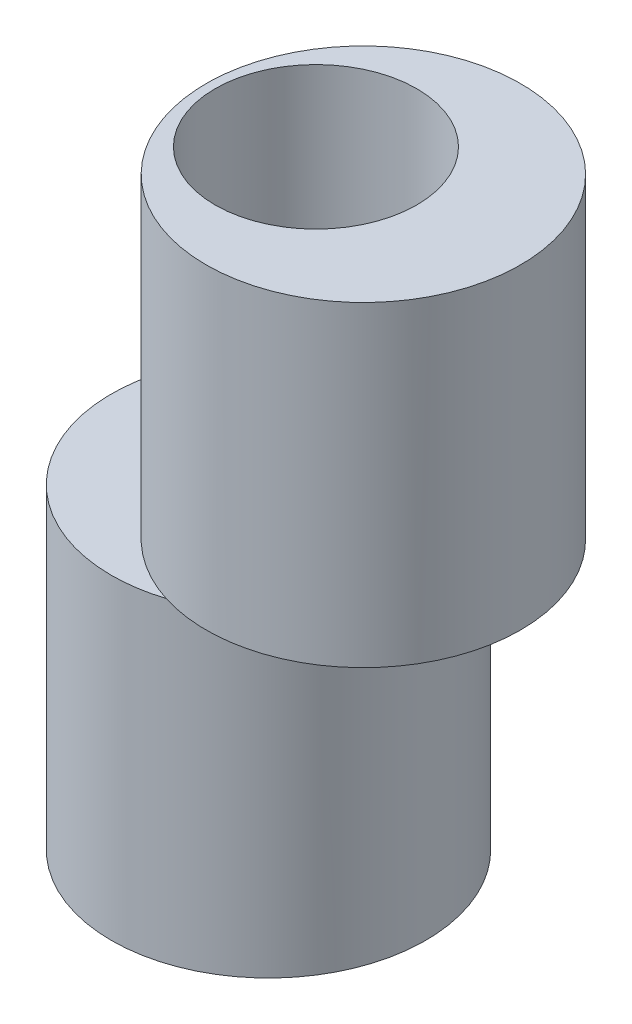
ISO-10303-21;
HEADER;
FILE_DESCRIPTION(('STEP AP214'),'2;1');
FILE_NAME('part.step','',(''),(''),'','','');
FILE_SCHEMA(('AUTOMOTIVE_DESIGN { 1 0 10303 214 1 1 1 1 }'));
ENDSEC;
DATA;
#1=APPLICATION_CONTEXT('core data for automotive mechanical design processes');
#2=APPLICATION_PROTOCOL_DEFINITION('international standard','automotive_design',2000,#1);
#3=PRODUCT_CONTEXT('',#1,'mechanical');
#4=PRODUCT('Part','Part','',(#3));
#5=PRODUCT_RELATED_PRODUCT_CATEGORY('part','',(#4));
#6=PRODUCT_DEFINITION_FORMATION('','',#4);
#7=PRODUCT_DEFINITION_CONTEXT('part definition',#1,'design');
#8=PRODUCT_DEFINITION('design','',#6,#7);
#9=PRODUCT_DEFINITION_SHAPE('','',#8);
#10=(LENGTH_UNIT() NAMED_UNIT(*) SI_UNIT(.MILLI.,.METRE.));
#11=(NAMED_UNIT(*) PLANE_ANGLE_UNIT() SI_UNIT($,.RADIAN.));
#12=(NAMED_UNIT(*) SI_UNIT($,.STERADIAN.) SOLID_ANGLE_UNIT());
#13=UNCERTAINTY_MEASURE_WITH_UNIT(LENGTH_MEASURE(1.E-05),#10,'distance_accuracy_value','');
#14=(GEOMETRIC_REPRESENTATION_CONTEXT(3) GLOBAL_UNCERTAINTY_ASSIGNED_CONTEXT((#13)) GLOBAL_UNIT_ASSIGNED_CONTEXT((#10,
#11,#12)) REPRESENTATION_CONTEXT('',''));
#15=CARTESIAN_POINT('',(0.,0.,0.));
#16=DIRECTION('',(0.,0.,1.));
#17=DIRECTION('',(1.,0.,0.));
#18=AXIS2_PLACEMENT_3D('',#15,#16,#17);
#19=CARTESIAN_POINT('',(0.,8.,0.));
#20=DIRECTION('',(0.,-1.,0.));
#21=DIRECTION('',(0.,0.,-1.));
#22=AXIS2_PLACEMENT_3D('',#19,#20,#21);
#23=CYLINDRICAL_SURFACE('',#22,3.975);
#24=CARTESIAN_POINT('',(0.,8.,0.));
#25=DIRECTION('',(0.,1.,0.));
#26=DIRECTION('',(0.,0.,1.));
#27=AXIS2_PLACEMENT_3D('',#24,#25,#26);
#28=CIRCLE('',#27,3.975);
#29=CARTESIAN_POINT('',(0.,8.,3.975));
#30=VERTEX_POINT('',#29);
#31=EDGE_CURVE('E11',#30,#30,#28,.T.);
#32=ORIENTED_EDGE('',*,*,#31,.F.);
#33=EDGE_LOOP('',(#32));
#34=FACE_BOUND('',#33,.T.);
#35=CARTESIAN_POINT('',(0.,0.,0.));
#36=DIRECTION('',(0.,1.,0.));
#37=DIRECTION('',(0.,0.,1.));
#38=AXIS2_PLACEMENT_3D('',#35,#36,#37);
#39=CIRCLE('',#38,3.975);
#40=CARTESIAN_POINT('',(-1.19999999997239,0.,-3.78954152900668));
#41=VERTEX_POINT('',#40);
#42=CARTESIAN_POINT('',(-1.19999999997238,0.,3.78954152900668));
#43=VERTEX_POINT('',#42);
#44=EDGE_CURVE('E42',#41,#43,#39,.T.);
#45=ORIENTED_EDGE('',*,*,#44,.T.);
#46=EDGE_CURVE('E66',#43,#41,#39,.T.);
#47=ORIENTED_EDGE('',*,*,#46,.T.);
#48=EDGE_LOOP('',(#45,#47));
#49=FACE_BOUND('',#48,.T.);
#50=ADVANCED_FACE('F41',(#34,#49),#23,.T.);
#51=CARTESIAN_POINT('',(0.,8.,0.));
#52=DIRECTION('',(0.,1.,0.));
#53=DIRECTION('',(0.,0.,1.));
#54=AXIS2_PLACEMENT_3D('',#51,#52,#53);
#55=PLANE('',#54);
#56=CARTESIAN_POINT('',(-1.19999999997238,8.,0.));
#57=DIRECTION('',(0.,1.,0.));
#58=DIRECTION('',(0.,0.,1.));
#59=AXIS2_PLACEMENT_3D('',#56,#57,#58);
#60=CIRCLE('',#59,2.55);
#61=CARTESIAN_POINT('',(-1.19999999997238,8.,2.55));
#62=VERTEX_POINT('',#61);
#63=EDGE_CURVE('E62',#62,#62,#60,.T.);
#64=ORIENTED_EDGE('',*,*,#63,.F.);
#65=EDGE_LOOP('',(#64));
#66=FACE_BOUND('',#65,.T.);
#67=ORIENTED_EDGE('',*,*,#31,.T.);
#68=EDGE_LOOP('',(#67));
#69=FACE_BOUND('',#68,.T.);
#70=ADVANCED_FACE('F75',(#66,#69),#55,.T.);
#71=CARTESIAN_POINT('',(0.,0.,0.));
#72=DIRECTION('',(0.,1.,0.));
#73=DIRECTION('',(0.,0.,1.));
#74=AXIS2_PLACEMENT_3D('',#71,#72,#73);
#75=PLANE('',#74);
#76=ORIENTED_EDGE('',*,*,#46,.F.);
#77=CARTESIAN_POINT('',(-2.39999999994476,0.,0.));
#78=DIRECTION('',(0.,1.,0.));
#79=DIRECTION('',(0.,0.,1.));
#80=AXIS2_PLACEMENT_3D('',#77,#78,#79);
#81=CIRCLE('',#80,3.975);
#82=EDGE_CURVE('E58',#43,#41,#81,.T.);
#83=ORIENTED_EDGE('',*,*,#82,.T.);
#84=EDGE_LOOP('',(#76,#83));
#85=FACE_BOUND('',#84,.T.);
#86=ADVANCED_FACE('F69',(#85),#75,.F.);
#87=CARTESIAN_POINT('',(-2.39999999994476,0.,0.));
#88=DIRECTION('',(0.,1.,0.));
#89=DIRECTION('',(0.,0.,1.));
#90=AXIS2_PLACEMENT_3D('',#87,#88,#89);
#91=PLANE('',#90);
#92=ORIENTED_EDGE('',*,*,#44,.F.);
#93=EDGE_CURVE('E53',#41,#43,#81,.T.);
#94=ORIENTED_EDGE('',*,*,#93,.T.);
#95=EDGE_LOOP('',(#92,#94));
#96=FACE_BOUND('',#95,.T.);
#97=ADVANCED_FACE('F60',(#96),#91,.T.);
#98=CARTESIAN_POINT('',(-2.39999999994476,-8.,0.));
#99=DIRECTION('',(0.,1.,0.));
#100=DIRECTION('',(0.,0.,1.));
#101=AXIS2_PLACEMENT_3D('',#98,#99,#100);
#102=CYLINDRICAL_SURFACE('',#101,3.975);
#103=CARTESIAN_POINT('',(-2.39999999994476,-8.,0.));
#104=DIRECTION('',(0.,1.,0.));
#105=DIRECTION('',(0.,0.,1.));
#106=AXIS2_PLACEMENT_3D('',#103,#104,#105);
#107=CIRCLE('',#106,3.975);
#108=CARTESIAN_POINT('',(-2.39999999994476,-8.,3.975));
#109=VERTEX_POINT('',#108);
#110=EDGE_CURVE('E70',#109,#109,#107,.T.);
#111=ORIENTED_EDGE('',*,*,#110,.T.);
#112=EDGE_LOOP('',(#111));
#113=FACE_BOUND('',#112,.T.);
#114=ORIENTED_EDGE('',*,*,#82,.F.);
#115=ORIENTED_EDGE('',*,*,#93,.F.);
#116=EDGE_LOOP('',(#114,#115));
#117=FACE_BOUND('',#116,.T.);
#118=ADVANCED_FACE('F61',(#113,#117),#102,.T.);
#119=CARTESIAN_POINT('',(-2.39999999994476,-8.,0.));
#120=DIRECTION('',(0.,1.,0.));
#121=DIRECTION('',(0.,0.,1.));
#122=AXIS2_PLACEMENT_3D('',#119,#120,#121);
#123=PLANE('',#122);
#124=CARTESIAN_POINT('',(-1.19999999997238,-8.,0.));
#125=DIRECTION('',(0.,1.,0.));
#126=DIRECTION('',(0.,0.,1.));
#127=AXIS2_PLACEMENT_3D('',#124,#125,#126);
#128=CIRCLE('',#127,2.55);
#129=CARTESIAN_POINT('',(-1.19999999997238,-8.,2.55));
#130=VERTEX_POINT('',#129);
#131=EDGE_CURVE('E102',#130,#130,#128,.T.);
#132=ORIENTED_EDGE('',*,*,#131,.T.);
#133=EDGE_LOOP('',(#132));
#134=FACE_BOUND('',#133,.T.);
#135=ORIENTED_EDGE('',*,*,#110,.F.);
#136=EDGE_LOOP('',(#135));
#137=FACE_BOUND('',#136,.T.);
#138=ADVANCED_FACE('F90',(#134,#137),#123,.F.);
#139=CARTESIAN_POINT('',(-1.19999999997238,8.,0.));
#140=DIRECTION('',(0.,-1.,0.));
#141=DIRECTION('',(0.,0.,-1.));
#142=AXIS2_PLACEMENT_3D('',#139,#140,#141);
#143=CYLINDRICAL_SURFACE('',#142,2.55);
#144=ORIENTED_EDGE('',*,*,#63,.T.);
#145=EDGE_LOOP('',(#144));
#146=FACE_BOUND('',#145,.T.);
#147=ORIENTED_EDGE('',*,*,#131,.F.);
#148=EDGE_LOOP('',(#147));
#149=FACE_BOUND('',#148,.T.);
#150=ADVANCED_FACE('F94',(#146,#149),#143,.F.);
#151=CLOSED_SHELL('',(#50,#70,#86,#97,#118,#138,#150));
#152=MANIFOLD_SOLID_BREP('B2',#151);
#153=ADVANCED_BREP_SHAPE_REPRESENTATION('',(#18,#152),#14);
#154=SHAPE_DEFINITION_REPRESENTATION(#9,#153);
ENDSEC;
END-ISO-10303-21;
